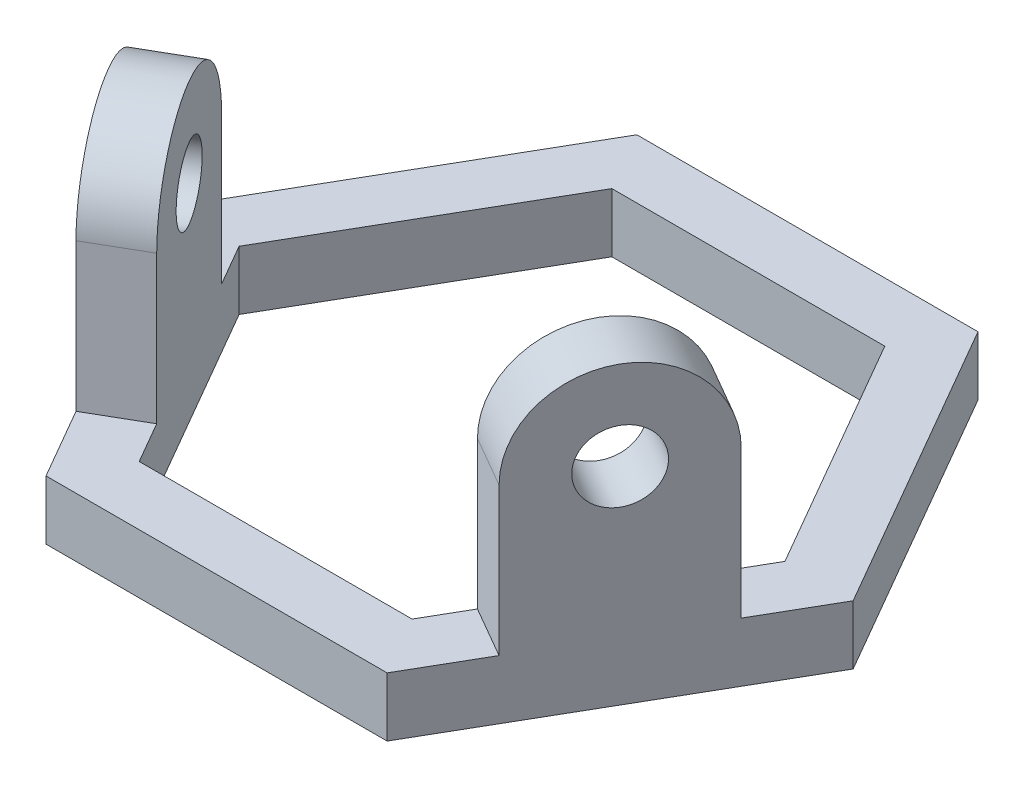
ISO-10303-21;
HEADER;
FILE_DESCRIPTION(('STEP AP214'),'2;1');
FILE_NAME('part.step','',(''),(''),'','','');
FILE_SCHEMA(('AUTOMOTIVE_DESIGN { 1 0 10303 214 1 1 1 1 }'));
ENDSEC;
DATA;
#1=APPLICATION_CONTEXT('core data for automotive mechanical design processes');
#2=APPLICATION_PROTOCOL_DEFINITION('international standard','automotive_design',2000,#1);
#3=PRODUCT_CONTEXT('',#1,'mechanical');
#4=PRODUCT('Part','Part','',(#3));
#5=PRODUCT_RELATED_PRODUCT_CATEGORY('part','',(#4));
#6=PRODUCT_DEFINITION_FORMATION('','',#4);
#7=PRODUCT_DEFINITION_CONTEXT('part definition',#1,'design');
#8=PRODUCT_DEFINITION('design','',#6,#7);
#9=PRODUCT_DEFINITION_SHAPE('','',#8);
#10=(LENGTH_UNIT() NAMED_UNIT(*) SI_UNIT(.MILLI.,.METRE.));
#11=(NAMED_UNIT(*) PLANE_ANGLE_UNIT() SI_UNIT($,.RADIAN.));
#12=(NAMED_UNIT(*) SI_UNIT($,.STERADIAN.) SOLID_ANGLE_UNIT());
#13=UNCERTAINTY_MEASURE_WITH_UNIT(LENGTH_MEASURE(1.E-05),#10,'distance_accuracy_value','');
#14=(GEOMETRIC_REPRESENTATION_CONTEXT(3) GLOBAL_UNCERTAINTY_ASSIGNED_CONTEXT((#13)) GLOBAL_UNIT_ASSIGNED_CONTEXT((#10,
#11,#12)) REPRESENTATION_CONTEXT('',''));
#15=CARTESIAN_POINT('',(0.,0.,0.));
#16=DIRECTION('',(0.,0.,1.));
#17=DIRECTION('',(1.,0.,0.));
#18=AXIS2_PLACEMENT_3D('',#15,#16,#17);
#19=CARTESIAN_POINT('',(0.,10.,0.));
#20=DIRECTION('',(0.,1.,0.));
#21=DIRECTION('',(0.,0.,1.));
#22=AXIS2_PLACEMENT_3D('',#19,#20,#21);
#23=PLANE('',#22);
#24=DIRECTION('',(0.866025403784434,0.,-0.500000000000009));
#25=VECTOR('',#24,1.);
#26=CARTESIAN_POINT('',(7.50000000000012,10.,12.9903810567665));
#27=LINE('',#26,#25);
#28=CARTESIAN_POINT('',(-35.8012701892216,10.,37.990381056767));
#29=VERTEX_POINT('',#28);
#30=CARTESIAN_POINT('',(-27.1410161513772,10.,32.9903810567668));
#31=VERTEX_POINT('',#30);
#32=EDGE_CURVE('E232',#29,#31,#27,.T.);
#33=ORIENTED_EDGE('',*,*,#32,.F.);
#34=DIRECTION('',(0.500000000000008,0.,0.866025403784434));
#35=VECTOR('',#34,1.);
#36=CARTESIAN_POINT('',(-57.7350269189626,10.,6.46272804624254E-13));
#37=LINE('',#36,#35);
#38=CARTESIAN_POINT('',(-28.8675134594808,10.,50.0000000000003));
#39=VERTEX_POINT('',#38);
#40=EDGE_CURVE('E189',#29,#39,#37,.T.);
#41=ORIENTED_EDGE('',*,*,#40,.T.);
#42=DIRECTION('',(1.,0.,0.));
#43=VECTOR('',#42,1.);
#44=CARTESIAN_POINT('',(-28.8675134594808,10.,50.0000000000003));
#45=LINE('',#44,#43);
#46=CARTESIAN_POINT('',(28.8675134594819,10.,49.9999999999997));
#47=VERTEX_POINT('',#46);
#48=EDGE_CURVE('E361',#39,#47,#45,.T.);
#49=ORIENTED_EDGE('',*,*,#48,.T.);
#50=DIRECTION('',(0.49999999999999,0.,-0.866025403784444));
#51=VECTOR('',#50,1.);
#52=CARTESIAN_POINT('',(28.8675134594819,10.,49.9999999999997));
#53=LINE('',#52,#51);
#54=CARTESIAN_POINT('',(35.8012701892224,10.,37.9903810567662));
#55=VERTEX_POINT('',#54);
#56=EDGE_CURVE('E343',#47,#55,#53,.T.);
#57=ORIENTED_EDGE('',*,*,#56,.T.);
#58=DIRECTION('',(0.866025403784444,0.,0.49999999999999));
#59=VECTOR('',#58,1.);
#60=CARTESIAN_POINT('',(-7.49999999999985,10.,12.9903810567667));
#61=LINE('',#60,#59);
#62=CARTESIAN_POINT('',(27.1410161513779,10.,32.9903810567663));
#63=VERTEX_POINT('',#62);
#64=EDGE_CURVE('E256',#63,#55,#61,.T.);
#65=ORIENTED_EDGE('',*,*,#64,.F.);
#66=DIRECTION('',(0.49999999999999,0.,-0.866025403784444));
#67=VECTOR('',#66,1.);
#68=CARTESIAN_POINT('',(23.0940107675855,10.,39.9999999999997));
#69=LINE('',#68,#67);
#70=CARTESIAN_POINT('',(23.0940107675855,10.,39.9999999999997));
#71=VERTEX_POINT('',#70);
#72=EDGE_CURVE('E297',#71,#63,#69,.T.);
#73=ORIENTED_EDGE('',*,*,#72,.F.);
#74=DIRECTION('',(1.,0.,0.));
#75=VECTOR('',#74,1.);
#76=CARTESIAN_POINT('',(-23.0940107675846,10.,40.0000000000003));
#77=LINE('',#76,#75);
#78=CARTESIAN_POINT('',(-23.0940107675846,10.,40.0000000000003));
#79=VERTEX_POINT('',#78);
#80=EDGE_CURVE('E292',#79,#71,#77,.T.);
#81=ORIENTED_EDGE('',*,*,#80,.F.);
#82=DIRECTION('',(0.50000000000001,0.,0.866025403784433));
#83=VECTOR('',#82,1.);
#84=CARTESIAN_POINT('',(-46.1880215351701,10.,5.03069808033274E-13));
#85=LINE('',#84,#83);
#86=EDGE_CURVE('E287',#31,#79,#85,.T.);
#87=ORIENTED_EDGE('',*,*,#86,.F.);
#88=EDGE_LOOP('',(#33,#41,#49,#57,#65,#73,#81,#87));
#89=FACE_BOUND('',#88,.T.);
#90=ADVANCED_FACE('F43',(#89),#23,.T.);
#91=DIRECTION('',(-0.866025403784434,0.,0.500000000000009));
#92=VECTOR('',#91,1.);
#93=CARTESIAN_POINT('',(-7.50000000000013,10.,-12.9903810567665));
#94=LINE('',#93,#92);
#95=CARTESIAN_POINT('',(-42.1410161513775,10.,7.00961894323384));
#96=VERTEX_POINT('',#95);
#97=CARTESIAN_POINT('',(-50.8012701892219,10.,12.009618943234));
#98=VERTEX_POINT('',#97);
#99=EDGE_CURVE('E220',#96,#98,#94,.T.);
#100=ORIENTED_EDGE('',*,*,#99,.F.);
#101=CARTESIAN_POINT('',(-46.1880215351701,10.,5.03069808033274E-13));
#102=VERTEX_POINT('',#101);
#103=EDGE_CURVE('E288',#102,#96,#85,.T.);
#104=ORIENTED_EDGE('',*,*,#103,.F.);
#105=DIRECTION('',(-0.49999999999999,0.,0.866025403784444));
#106=VECTOR('',#105,1.);
#107=CARTESIAN_POINT('',(-23.0940107675855,10.,-39.9999999999997));
#108=LINE('',#107,#106);
#109=CARTESIAN_POINT('',(-23.0940107675855,10.,-39.9999999999997));
#110=VERTEX_POINT('',#109);
#111=EDGE_CURVE('E284',#110,#102,#108,.T.);
#112=ORIENTED_EDGE('',*,*,#111,.F.);
#113=DIRECTION('',(-1.,0.,0.));
#114=VECTOR('',#113,1.);
#115=CARTESIAN_POINT('',(23.0940107675846,10.,-40.0000000000003));
#116=LINE('',#115,#114);
#117=CARTESIAN_POINT('',(23.0940107675846,10.,-40.0000000000003));
#118=VERTEX_POINT('',#117);
#119=EDGE_CURVE('E280',#118,#110,#116,.T.);
#120=ORIENTED_EDGE('',*,*,#119,.F.);
#121=DIRECTION('',(-0.50000000000001,0.,-0.866025403784433));
#122=VECTOR('',#121,1.);
#123=CARTESIAN_POINT('',(46.1880215351701,10.,-5.03069808033274E-13));
#124=LINE('',#123,#122);
#125=CARTESIAN_POINT('',(46.1880215351701,10.,-5.03069808033274E-13));
#126=VERTEX_POINT('',#125);
#127=EDGE_CURVE('E277',#126,#118,#124,.T.);
#128=ORIENTED_EDGE('',*,*,#127,.F.);
#129=CARTESIAN_POINT('',(42.1410161513776,10.,7.00961894323296));
#130=VERTEX_POINT('',#129);
#131=EDGE_CURVE('E296',#130,#126,#69,.T.);
#132=ORIENTED_EDGE('',*,*,#131,.F.);
#133=DIRECTION('',(-0.866025403784444,0.,-0.49999999999999));
#134=VECTOR('',#133,1.);
#135=CARTESIAN_POINT('',(7.49999999999986,10.,-12.9903810567667));
#136=LINE('',#135,#134);
#137=CARTESIAN_POINT('',(50.8012701892221,10.,12.0096189432329));
#138=VERTEX_POINT('',#137);
#139=EDGE_CURVE('E273',#138,#130,#136,.T.);
#140=ORIENTED_EDGE('',*,*,#139,.F.);
#141=CARTESIAN_POINT('',(57.7350269189626,10.,-6.45317133063372E-13));
#142=VERTEX_POINT('',#141);
#143=EDGE_CURVE('E348',#138,#142,#53,.T.);
#144=ORIENTED_EDGE('',*,*,#143,.T.);
#145=DIRECTION('',(-0.50000000000001,0.,-0.866025403784433));
#146=VECTOR('',#145,1.);
#147=CARTESIAN_POINT('',(57.7350269189626,10.,-6.45317133063372E-13));
#148=LINE('',#147,#146);
#149=CARTESIAN_POINT('',(28.8675134594807,10.,-50.0000000000003));
#150=VERTEX_POINT('',#149);
#151=EDGE_CURVE('E347',#142,#150,#148,.T.);
#152=ORIENTED_EDGE('',*,*,#151,.T.);
#153=DIRECTION('',(-1.,0.,0.));
#154=VECTOR('',#153,1.);
#155=CARTESIAN_POINT('',(28.8675134594807,10.,-50.0000000000003));
#156=LINE('',#155,#154);
#157=CARTESIAN_POINT('',(-28.8675134594819,10.,-49.9999999999997));
#158=VERTEX_POINT('',#157);
#159=EDGE_CURVE('E351',#150,#158,#156,.T.);
#160=ORIENTED_EDGE('',*,*,#159,.T.);
#161=DIRECTION('',(-0.49999999999999,0.,0.866025403784444));
#162=VECTOR('',#161,1.);
#163=CARTESIAN_POINT('',(-28.8675134594819,10.,-49.9999999999997));
#164=LINE('',#163,#162);
#165=CARTESIAN_POINT('',(-57.7350269189626,10.,6.46272804624254E-13));
#166=VERTEX_POINT('',#165);
#167=EDGE_CURVE('E354',#158,#166,#164,.T.);
#168=ORIENTED_EDGE('',*,*,#167,.T.);
#169=EDGE_CURVE('E357',#166,#98,#37,.T.);
#170=ORIENTED_EDGE('',*,*,#169,.T.);
#171=EDGE_LOOP('',(#100,#104,#112,#120,#128,#132,#140,#144,#152,#160,#168,#170));
#172=FACE_BOUND('',#171,.T.);
#173=ADVANCED_FACE('F420',(#172),#23,.T.);
#174=CARTESIAN_POINT('',(0.,0.,0.));
#175=DIRECTION('',(0.,1.,0.));
#176=DIRECTION('',(0.,0.,1.));
#177=AXIS2_PLACEMENT_3D('',#174,#175,#176);
#178=PLANE('',#177);
#179=DIRECTION('',(0.50000000000001,0.,0.866025403784433));
#180=VECTOR('',#179,1.);
#181=CARTESIAN_POINT('',(-46.1880215351701,0.,5.03069808033274E-13));
#182=LINE('',#181,#180);
#183=CARTESIAN_POINT('',(-46.1880215351701,0.,5.03069808033274E-13));
#184=VERTEX_POINT('',#183);
#185=CARTESIAN_POINT('',(-23.0940107675846,0.,40.0000000000003));
#186=VERTEX_POINT('',#185);
#187=EDGE_CURVE('E313',#184,#186,#182,.T.);
#188=ORIENTED_EDGE('',*,*,#187,.T.);
#189=DIRECTION('',(1.,0.,0.));
#190=VECTOR('',#189,1.);
#191=CARTESIAN_POINT('',(-23.0940107675846,0.,40.0000000000003));
#192=LINE('',#191,#190);
#193=CARTESIAN_POINT('',(23.0940107675855,0.,39.9999999999997));
#194=VERTEX_POINT('',#193);
#195=EDGE_CURVE('E316',#186,#194,#192,.T.);
#196=ORIENTED_EDGE('',*,*,#195,.T.);
#197=DIRECTION('',(0.49999999999999,0.,-0.866025403784444));
#198=VECTOR('',#197,1.);
#199=CARTESIAN_POINT('',(23.0940107675855,0.,39.9999999999997));
#200=LINE('',#199,#198);
#201=CARTESIAN_POINT('',(46.1880215351701,0.,-5.03069808033274E-13));
#202=VERTEX_POINT('',#201);
#203=EDGE_CURVE('E281',#194,#202,#200,.T.);
#204=ORIENTED_EDGE('',*,*,#203,.T.);
#205=DIRECTION('',(-0.50000000000001,0.,-0.866025403784433));
#206=VECTOR('',#205,1.);
#207=CARTESIAN_POINT('',(46.1880215351701,0.,-5.03069808033274E-13));
#208=LINE('',#207,#206);
#209=CARTESIAN_POINT('',(23.0940107675846,0.,-40.0000000000003));
#210=VERTEX_POINT('',#209);
#211=EDGE_CURVE('E276',#202,#210,#208,.T.);
#212=ORIENTED_EDGE('',*,*,#211,.T.);
#213=DIRECTION('',(-1.,0.,0.));
#214=VECTOR('',#213,1.);
#215=CARTESIAN_POINT('',(23.0940107675846,0.,-40.0000000000003));
#216=LINE('',#215,#214);
#217=CARTESIAN_POINT('',(-23.0940107675855,0.,-39.9999999999997));
#218=VERTEX_POINT('',#217);
#219=EDGE_CURVE('E305',#210,#218,#216,.T.);
#220=ORIENTED_EDGE('',*,*,#219,.T.);
#221=DIRECTION('',(-0.49999999999999,0.,0.866025403784444));
#222=VECTOR('',#221,1.);
#223=CARTESIAN_POINT('',(-23.0940107675855,0.,-39.9999999999997));
#224=LINE('',#223,#222);
#225=EDGE_CURVE('E309',#218,#184,#224,.T.);
#226=ORIENTED_EDGE('',*,*,#225,.T.);
#227=EDGE_LOOP('',(#188,#196,#204,#212,#220,#226));
#228=FACE_BOUND('',#227,.T.);
#229=DIRECTION('',(1.,0.,0.));
#230=VECTOR('',#229,1.);
#231=CARTESIAN_POINT('',(-28.8675134594808,0.,50.0000000000003));
#232=LINE('',#231,#230);
#233=CARTESIAN_POINT('',(-28.8675134594808,0.,50.0000000000003));
#234=VERTEX_POINT('',#233);
#235=CARTESIAN_POINT('',(28.8675134594819,0.,49.9999999999997));
#236=VERTEX_POINT('',#235);
#237=EDGE_CURVE('E379',#234,#236,#232,.T.);
#238=ORIENTED_EDGE('',*,*,#237,.F.);
#239=DIRECTION('',(0.500000000000008,0.,0.866025403784434));
#240=VECTOR('',#239,1.);
#241=CARTESIAN_POINT('',(-57.7350269189626,0.,6.46272804624254E-13));
#242=LINE('',#241,#240);
#243=CARTESIAN_POINT('',(-57.7350269189626,0.,6.46272804624254E-13));
#244=VERTEX_POINT('',#243);
#245=EDGE_CURVE('E376',#244,#234,#242,.T.);
#246=ORIENTED_EDGE('',*,*,#245,.F.);
#247=DIRECTION('',(-0.49999999999999,0.,0.866025403784444));
#248=VECTOR('',#247,1.);
#249=CARTESIAN_POINT('',(-28.8675134594819,0.,-49.9999999999997));
#250=LINE('',#249,#248);
#251=CARTESIAN_POINT('',(-28.8675134594819,0.,-49.9999999999997));
#252=VERTEX_POINT('',#251);
#253=EDGE_CURVE('E373',#252,#244,#250,.T.);
#254=ORIENTED_EDGE('',*,*,#253,.F.);
#255=DIRECTION('',(-1.,0.,0.));
#256=VECTOR('',#255,1.);
#257=CARTESIAN_POINT('',(28.8675134594807,0.,-50.0000000000003));
#258=LINE('',#257,#256);
#259=CARTESIAN_POINT('',(28.8675134594807,0.,-50.0000000000003));
#260=VERTEX_POINT('',#259);
#261=EDGE_CURVE('E370',#260,#252,#258,.T.);
#262=ORIENTED_EDGE('',*,*,#261,.F.);
#263=DIRECTION('',(-0.50000000000001,0.,-0.866025403784433));
#264=VECTOR('',#263,1.);
#265=CARTESIAN_POINT('',(57.7350269189626,0.,-6.45317133063372E-13));
#266=LINE('',#265,#264);
#267=CARTESIAN_POINT('',(57.7350269189626,0.,-6.45317133063372E-13));
#268=VERTEX_POINT('',#267);
#269=EDGE_CURVE('E367',#268,#260,#266,.T.);
#270=ORIENTED_EDGE('',*,*,#269,.F.);
#271=DIRECTION('',(0.49999999999999,0.,-0.866025403784444));
#272=VECTOR('',#271,1.);
#273=CARTESIAN_POINT('',(28.8675134594819,0.,49.9999999999997));
#274=LINE('',#273,#272);
#275=EDGE_CURVE('E342',#236,#268,#274,.T.);
#276=ORIENTED_EDGE('',*,*,#275,.F.);
#277=EDGE_LOOP('',(#238,#246,#254,#262,#270,#276));
#278=FACE_BOUND('',#277,.T.);
#279=ADVANCED_FACE('F410',(#228,#278),#178,.F.);
#280=CARTESIAN_POINT('',(28.8675134594819,10.,49.9999999999997));
#281=DIRECTION('',(-0.866025403784444,0.,-0.49999999999999));
#282=DIRECTION('',(-0.49999999999999,0.,0.866025403784444));
#283=AXIS2_PLACEMENT_3D('',#280,#281,#282);
#284=PLANE('',#283);
#285=ORIENTED_EDGE('',*,*,#275,.T.);
#286=DIRECTION('',(0.,-1.,0.));
#287=VECTOR('',#286,1.);
#288=CARTESIAN_POINT('',(57.7350269189626,10.,-6.45317133063372E-13));
#289=LINE('',#288,#287);
#290=EDGE_CURVE('E11',#142,#268,#289,.T.);
#291=ORIENTED_EDGE('',*,*,#290,.F.);
#292=ORIENTED_EDGE('',*,*,#143,.F.);
#293=DIRECTION('',(0.,1.,0.));
#294=VECTOR('',#293,1.);
#295=CARTESIAN_POINT('',(50.8012701892221,0.,12.0096189432329));
#296=LINE('',#295,#294);
#297=CARTESIAN_POINT('',(50.8012701892221,35.,12.0096189432329));
#298=VERTEX_POINT('',#297);
#299=EDGE_CURVE('E236',#138,#298,#296,.T.);
#300=ORIENTED_EDGE('',*,*,#299,.T.);
#301=CARTESIAN_POINT('',(43.3012701892223,35.,24.9999999999995));
#302=DIRECTION('',(0.866025403784444,0.,0.49999999999999));
#303=DIRECTION('',(-0.49999999999999,0.,0.866025403784444));
#304=AXIS2_PLACEMENT_3D('',#301,#302,#303);
#305=CIRCLE('',#304,15.);
#306=CARTESIAN_POINT('',(35.8012701892224,35.,37.9903810567662));
#307=VERTEX_POINT('',#306);
#308=EDGE_CURVE('E244',#298,#307,#305,.T.);
#309=ORIENTED_EDGE('',*,*,#308,.T.);
#310=DIRECTION('',(0.,-1.,0.));
#311=VECTOR('',#310,1.);
#312=CARTESIAN_POINT('',(35.8012701892224,35.,37.9903810567662));
#313=LINE('',#312,#311);
#314=EDGE_CURVE('E240',#307,#55,#313,.T.);
#315=ORIENTED_EDGE('',*,*,#314,.T.);
#316=ORIENTED_EDGE('',*,*,#56,.F.);
#317=DIRECTION('',(0.,-1.,0.));
#318=VECTOR('',#317,1.);
#319=CARTESIAN_POINT('',(28.8675134594819,10.,49.9999999999997));
#320=LINE('',#319,#318);
#321=EDGE_CURVE('E364',#47,#236,#320,.T.);
#322=ORIENTED_EDGE('',*,*,#321,.T.);
#323=EDGE_LOOP('',(#285,#291,#292,#300,#309,#315,#316,#322));
#324=FACE_BOUND('',#323,.T.);
#325=CARTESIAN_POINT('',(43.3012701892223,35.,24.9999999999995));
#326=DIRECTION('',(0.866025403784444,0.,0.49999999999999));
#327=DIRECTION('',(0.49999999999999,0.,-0.866025403784444));
#328=AXIS2_PLACEMENT_3D('',#325,#326,#327);
#329=CIRCLE('',#328,6.);
#330=CARTESIAN_POINT('',(46.3012701892222,35.,19.8038475772929));
#331=VERTEX_POINT('',#330);
#332=EDGE_CURVE('E248',#331,#331,#329,.T.);
#333=ORIENTED_EDGE('',*,*,#332,.F.);
#334=EDGE_LOOP('',(#333));
#335=FACE_BOUND('',#334,.T.);
#336=ADVANCED_FACE('F45',(#324,#335),#284,.F.);
#337=CARTESIAN_POINT('',(57.7350269189626,10.,-6.45317133063372E-13));
#338=DIRECTION('',(-0.866025403784433,0.,0.50000000000001));
#339=DIRECTION('',(0.50000000000001,0.,0.866025403784433));
#340=AXIS2_PLACEMENT_3D('',#337,#338,#339);
#341=PLANE('',#340);
#342=ORIENTED_EDGE('',*,*,#269,.T.);
#343=DIRECTION('',(0.,-1.,0.));
#344=VECTOR('',#343,1.);
#345=CARTESIAN_POINT('',(28.8675134594807,10.,-50.0000000000003));
#346=LINE('',#345,#344);
#347=EDGE_CURVE('E52',#150,#260,#346,.T.);
#348=ORIENTED_EDGE('',*,*,#347,.F.);
#349=ORIENTED_EDGE('',*,*,#151,.F.);
#350=ORIENTED_EDGE('',*,*,#290,.T.);
#351=EDGE_LOOP('',(#342,#348,#349,#350));
#352=FACE_BOUND('',#351,.T.);
#353=ADVANCED_FACE('F425',(#352),#341,.F.);
#354=CARTESIAN_POINT('',(28.8675134594807,10.,-50.0000000000003));
#355=DIRECTION('',(0.,0.,1.));
#356=DIRECTION('',(1.,0.,0.));
#357=AXIS2_PLACEMENT_3D('',#354,#355,#356);
#358=PLANE('',#357);
#359=ORIENTED_EDGE('',*,*,#261,.T.);
#360=DIRECTION('',(0.,-1.,0.));
#361=VECTOR('',#360,1.);
#362=CARTESIAN_POINT('',(-28.8675134594819,10.,-49.9999999999997));
#363=LINE('',#362,#361);
#364=EDGE_CURVE('E393',#158,#252,#363,.T.);
#365=ORIENTED_EDGE('',*,*,#364,.F.);
#366=ORIENTED_EDGE('',*,*,#159,.F.);
#367=ORIENTED_EDGE('',*,*,#347,.T.);
#368=EDGE_LOOP('',(#359,#365,#366,#367));
#369=FACE_BOUND('',#368,.T.);
#370=ADVANCED_FACE('F402',(#369),#358,.F.);
#371=CARTESIAN_POINT('',(-28.8675134594819,10.,-49.9999999999997));
#372=DIRECTION('',(0.866025403784444,0.,0.49999999999999));
#373=DIRECTION('',(0.49999999999999,0.,-0.866025403784444));
#374=AXIS2_PLACEMENT_3D('',#371,#372,#373);
#375=PLANE('',#374);
#376=ORIENTED_EDGE('',*,*,#253,.T.);
#377=DIRECTION('',(0.,-1.,0.));
#378=VECTOR('',#377,1.);
#379=CARTESIAN_POINT('',(-57.7350269189626,10.,6.46272804624254E-13));
#380=LINE('',#379,#378);
#381=EDGE_CURVE('E389',#166,#244,#380,.T.);
#382=ORIENTED_EDGE('',*,*,#381,.F.);
#383=ORIENTED_EDGE('',*,*,#167,.F.);
#384=ORIENTED_EDGE('',*,*,#364,.T.);
#385=EDGE_LOOP('',(#376,#382,#383,#384));
#386=FACE_BOUND('',#385,.T.);
#387=ADVANCED_FACE('F415',(#386),#375,.F.);
#388=CARTESIAN_POINT('',(-57.7350269189626,10.,6.46272804624254E-13));
#389=DIRECTION('',(0.866025403784434,0.,-0.500000000000008));
#390=DIRECTION('',(-0.500000000000008,0.,-0.866025403784434));
#391=AXIS2_PLACEMENT_3D('',#388,#389,#390);
#392=PLANE('',#391);
#393=ORIENTED_EDGE('',*,*,#245,.T.);
#394=DIRECTION('',(0.,-1.,0.));
#395=VECTOR('',#394,1.);
#396=CARTESIAN_POINT('',(-28.8675134594808,10.,50.0000000000003));
#397=LINE('',#396,#395);
#398=EDGE_CURVE('E385',#39,#234,#397,.T.);
#399=ORIENTED_EDGE('',*,*,#398,.F.);
#400=ORIENTED_EDGE('',*,*,#40,.F.);
#401=DIRECTION('',(0.,1.,0.));
#402=VECTOR('',#401,1.);
#403=CARTESIAN_POINT('',(-35.8012701892216,0.,37.990381056767));
#404=LINE('',#403,#402);
#405=CARTESIAN_POINT('',(-35.8012701892216,35.,37.990381056767));
#406=VERTEX_POINT('',#405);
#407=EDGE_CURVE('E181',#29,#406,#404,.T.);
#408=ORIENTED_EDGE('',*,*,#407,.T.);
#409=CARTESIAN_POINT('',(-43.3012701892218,35.,25.0000000000005));
#410=DIRECTION('',(-0.866025403784434,0.,0.500000000000008));
#411=DIRECTION('',(-0.500000000000009,0.,-0.866025403784434));
#412=AXIS2_PLACEMENT_3D('',#409,#410,#411);
#413=CIRCLE('',#412,15.);
#414=CARTESIAN_POINT('',(-50.8012701892219,35.,12.009618943234));
#415=VERTEX_POINT('',#414);
#416=EDGE_CURVE('E187',#406,#415,#413,.T.);
#417=ORIENTED_EDGE('',*,*,#416,.T.);
#418=DIRECTION('',(0.,-1.,0.));
#419=VECTOR('',#418,1.);
#420=CARTESIAN_POINT('',(-50.8012701892219,35.,12.009618943234));
#421=LINE('',#420,#419);
#422=EDGE_CURVE('E194',#415,#98,#421,.T.);
#423=ORIENTED_EDGE('',*,*,#422,.T.);
#424=ORIENTED_EDGE('',*,*,#169,.F.);
#425=ORIENTED_EDGE('',*,*,#381,.T.);
#426=EDGE_LOOP('',(#393,#399,#400,#408,#417,#423,#424,#425));
#427=FACE_BOUND('',#426,.T.);
#428=CARTESIAN_POINT('',(-43.3012701892218,35.,25.0000000000005));
#429=DIRECTION('',(-0.866025403784434,0.,0.500000000000008));
#430=DIRECTION('',(0.500000000000009,0.,0.866025403784434));
#431=AXIS2_PLACEMENT_3D('',#428,#429,#430);
#432=CIRCLE('',#431,6.);
#433=CARTESIAN_POINT('',(-40.3012701892217,35.,30.1961524227071));
#434=VERTEX_POINT('',#433);
#435=EDGE_CURVE('E209',#434,#434,#432,.T.);
#436=ORIENTED_EDGE('',*,*,#435,.F.);
#437=EDGE_LOOP('',(#436));
#438=FACE_BOUND('',#437,.T.);
#439=ADVANCED_FACE('F183',(#427,#438),#392,.F.);
#440=CARTESIAN_POINT('',(-28.8675134594808,10.,50.0000000000003));
#441=DIRECTION('',(0.,0.,-1.));
#442=DIRECTION('',(-1.,0.,0.));
#443=AXIS2_PLACEMENT_3D('',#440,#441,#442);
#444=PLANE('',#443);
#445=ORIENTED_EDGE('',*,*,#237,.T.);
#446=ORIENTED_EDGE('',*,*,#321,.F.);
#447=ORIENTED_EDGE('',*,*,#48,.F.);
#448=ORIENTED_EDGE('',*,*,#398,.T.);
#449=EDGE_LOOP('',(#445,#446,#447,#448));
#450=FACE_BOUND('',#449,.T.);
#451=ADVANCED_FACE('F431',(#450),#444,.F.);
#452=CARTESIAN_POINT('',(46.1880215351701,10.,-5.03069808033274E-13));
#453=DIRECTION('',(-0.866025403784433,0.,0.50000000000001));
#454=DIRECTION('',(0.50000000000001,0.,0.866025403784433));
#455=AXIS2_PLACEMENT_3D('',#452,#453,#454);
#456=PLANE('',#455);
#457=ORIENTED_EDGE('',*,*,#211,.F.);
#458=DIRECTION('',(0.,-1.,0.));
#459=VECTOR('',#458,1.);
#460=CARTESIAN_POINT('',(46.1880215351701,10.,-5.03069808033274E-13));
#461=LINE('',#460,#459);
#462=EDGE_CURVE('E301',#126,#202,#461,.T.);
#463=ORIENTED_EDGE('',*,*,#462,.F.);
#464=ORIENTED_EDGE('',*,*,#127,.T.);
#465=DIRECTION('',(0.,-1.,0.));
#466=VECTOR('',#465,1.);
#467=CARTESIAN_POINT('',(23.0940107675846,10.,-40.0000000000003));
#468=LINE('',#467,#466);
#469=EDGE_CURVE('E338',#118,#210,#468,.T.);
#470=ORIENTED_EDGE('',*,*,#469,.T.);
#471=EDGE_LOOP('',(#457,#463,#464,#470));
#472=FACE_BOUND('',#471,.T.);
#473=ADVANCED_FACE('F467',(#472),#456,.T.);
#474=CARTESIAN_POINT('',(23.0940107675846,10.,-40.0000000000003));
#475=DIRECTION('',(0.,0.,1.));
#476=DIRECTION('',(1.,0.,0.));
#477=AXIS2_PLACEMENT_3D('',#474,#475,#476);
#478=PLANE('',#477);
#479=ORIENTED_EDGE('',*,*,#219,.F.);
#480=ORIENTED_EDGE('',*,*,#469,.F.);
#481=ORIENTED_EDGE('',*,*,#119,.T.);
#482=DIRECTION('',(0.,-1.,0.));
#483=VECTOR('',#482,1.);
#484=CARTESIAN_POINT('',(-23.0940107675855,10.,-39.9999999999997));
#485=LINE('',#484,#483);
#486=EDGE_CURVE('E335',#110,#218,#485,.T.);
#487=ORIENTED_EDGE('',*,*,#486,.T.);
#488=EDGE_LOOP('',(#479,#480,#481,#487));
#489=FACE_BOUND('',#488,.T.);
#490=ADVANCED_FACE('F464',(#489),#478,.T.);
#491=CARTESIAN_POINT('',(-23.0940107675855,10.,-39.9999999999997));
#492=DIRECTION('',(0.866025403784444,0.,0.49999999999999));
#493=DIRECTION('',(0.49999999999999,0.,-0.866025403784444));
#494=AXIS2_PLACEMENT_3D('',#491,#492,#493);
#495=PLANE('',#494);
#496=ORIENTED_EDGE('',*,*,#225,.F.);
#497=ORIENTED_EDGE('',*,*,#486,.F.);
#498=ORIENTED_EDGE('',*,*,#111,.T.);
#499=DIRECTION('',(0.,-1.,0.));
#500=VECTOR('',#499,1.);
#501=CARTESIAN_POINT('',(-46.1880215351701,10.,5.03069808033274E-13));
#502=LINE('',#501,#500);
#503=EDGE_CURVE('E332',#102,#184,#502,.T.);
#504=ORIENTED_EDGE('',*,*,#503,.T.);
#505=EDGE_LOOP('',(#496,#497,#498,#504));
#506=FACE_BOUND('',#505,.T.);
#507=ADVANCED_FACE('F462',(#506),#495,.T.);
#508=CARTESIAN_POINT('',(-46.1880215351701,10.,5.03069808033274E-13));
#509=DIRECTION('',(0.866025403784433,0.,-0.50000000000001));
#510=DIRECTION('',(-0.50000000000001,0.,-0.866025403784433));
#511=AXIS2_PLACEMENT_3D('',#508,#509,#510);
#512=PLANE('',#511);
#513=ORIENTED_EDGE('',*,*,#103,.T.);
#514=DIRECTION('',(0.,-1.,0.));
#515=VECTOR('',#514,1.);
#516=CARTESIAN_POINT('',(-42.1410161513775,35.,7.00961894323384));
#517=LINE('',#516,#515);
#518=CARTESIAN_POINT('',(-42.1410161513775,35.,7.00961894323384));
#519=VERTEX_POINT('',#518);
#520=EDGE_CURVE('E202',#519,#96,#517,.T.);
#521=ORIENTED_EDGE('',*,*,#520,.F.);
#522=CARTESIAN_POINT('',(-34.6410161513773,35.,20.0000000000003));
#523=DIRECTION('',(0.866025403784433,0.,-0.50000000000001));
#524=DIRECTION('',(-0.50000000000001,0.,-0.866025403784433));
#525=AXIS2_PLACEMENT_3D('',#522,#523,#524);
#526=CIRCLE('',#525,15.);
#527=CARTESIAN_POINT('',(-27.1410161513772,35.,32.9903810567668));
#528=VERTEX_POINT('',#527);
#529=EDGE_CURVE('E223',#528,#519,#526,.F.);
#530=ORIENTED_EDGE('',*,*,#529,.F.);
#531=DIRECTION('',(0.,1.,0.));
#532=VECTOR('',#531,1.);
#533=CARTESIAN_POINT('',(-27.1410161513772,0.,32.9903810567668));
#534=LINE('',#533,#532);
#535=EDGE_CURVE('E59',#31,#528,#534,.T.);
#536=ORIENTED_EDGE('',*,*,#535,.F.);
#537=ORIENTED_EDGE('',*,*,#86,.T.);
#538=DIRECTION('',(0.,-1.,0.));
#539=VECTOR('',#538,1.);
#540=CARTESIAN_POINT('',(-23.0940107675846,10.,40.0000000000003));
#541=LINE('',#540,#539);
#542=EDGE_CURVE('E328',#79,#186,#541,.T.);
#543=ORIENTED_EDGE('',*,*,#542,.T.);
#544=ORIENTED_EDGE('',*,*,#187,.F.);
#545=ORIENTED_EDGE('',*,*,#503,.F.);
#546=EDGE_LOOP('',(#513,#521,#530,#536,#537,#543,#544,#545));
#547=FACE_BOUND('',#546,.T.);
#548=CARTESIAN_POINT('',(-34.6410161513773,35.,20.0000000000003));
#549=DIRECTION('',(0.866025403784433,0.,-0.50000000000001));
#550=DIRECTION('',(-0.50000000000001,0.,-0.866025403784433));
#551=AXIS2_PLACEMENT_3D('',#548,#549,#550);
#552=CIRCLE('',#551,6.);
#553=CARTESIAN_POINT('',(-37.6410161513774,35.,14.8038475772937));
#554=VERTEX_POINT('',#553);
#555=EDGE_CURVE('E193',#554,#554,#552,.F.);
#556=ORIENTED_EDGE('',*,*,#555,.T.);
#557=EDGE_LOOP('',(#556));
#558=FACE_BOUND('',#557,.T.);
#559=ADVANCED_FACE('F441',(#547,#558),#512,.T.);
#560=CARTESIAN_POINT('',(-23.0940107675846,10.,40.0000000000003));
#561=DIRECTION('',(0.,0.,-1.));
#562=DIRECTION('',(-1.,0.,0.));
#563=AXIS2_PLACEMENT_3D('',#560,#561,#562);
#564=PLANE('',#563);
#565=ORIENTED_EDGE('',*,*,#195,.F.);
#566=ORIENTED_EDGE('',*,*,#542,.F.);
#567=ORIENTED_EDGE('',*,*,#80,.T.);
#568=DIRECTION('',(0.,-1.,0.));
#569=VECTOR('',#568,1.);
#570=CARTESIAN_POINT('',(23.0940107675855,10.,39.9999999999997));
#571=LINE('',#570,#569);
#572=EDGE_CURVE('E325',#71,#194,#571,.T.);
#573=ORIENTED_EDGE('',*,*,#572,.T.);
#574=EDGE_LOOP('',(#565,#566,#567,#573));
#575=FACE_BOUND('',#574,.T.);
#576=ADVANCED_FACE('F447',(#575),#564,.T.);
#577=CARTESIAN_POINT('',(23.0940107675855,10.,39.9999999999997));
#578=DIRECTION('',(-0.866025403784444,0.,-0.49999999999999));
#579=DIRECTION('',(-0.49999999999999,0.,0.866025403784444));
#580=AXIS2_PLACEMENT_3D('',#577,#578,#579);
#581=PLANE('',#580);
#582=ORIENTED_EDGE('',*,*,#72,.T.);
#583=DIRECTION('',(0.,-1.,0.));
#584=VECTOR('',#583,1.);
#585=CARTESIAN_POINT('',(27.1410161513779,35.,32.9903810567663));
#586=LINE('',#585,#584);
#587=CARTESIAN_POINT('',(27.1410161513779,35.,32.9903810567663));
#588=VERTEX_POINT('',#587);
#589=EDGE_CURVE('E252',#588,#63,#586,.T.);
#590=ORIENTED_EDGE('',*,*,#589,.F.);
#591=CARTESIAN_POINT('',(34.6410161513778,35.,19.9999999999996));
#592=DIRECTION('',(-0.866025403784444,0.,-0.49999999999999));
#593=DIRECTION('',(-0.49999999999999,0.,0.866025403784444));
#594=AXIS2_PLACEMENT_3D('',#591,#592,#593);
#595=CIRCLE('',#594,15.);
#596=CARTESIAN_POINT('',(42.1410161513776,35.,7.00961894323296));
#597=VERTEX_POINT('',#596);
#598=EDGE_CURVE('E235',#597,#588,#595,.F.);
#599=ORIENTED_EDGE('',*,*,#598,.F.);
#600=DIRECTION('',(0.,1.,0.));
#601=VECTOR('',#600,1.);
#602=CARTESIAN_POINT('',(42.1410161513776,0.,7.00961894323296));
#603=LINE('',#602,#601);
#604=EDGE_CURVE('E67',#130,#597,#603,.T.);
#605=ORIENTED_EDGE('',*,*,#604,.F.);
#606=ORIENTED_EDGE('',*,*,#131,.T.);
#607=ORIENTED_EDGE('',*,*,#462,.T.);
#608=ORIENTED_EDGE('',*,*,#203,.F.);
#609=ORIENTED_EDGE('',*,*,#572,.F.);
#610=EDGE_LOOP('',(#582,#590,#599,#605,#606,#607,#608,#609));
#611=FACE_BOUND('',#610,.T.);
#612=CARTESIAN_POINT('',(34.6410161513778,35.,19.9999999999996));
#613=DIRECTION('',(-0.866025403784444,0.,-0.49999999999999));
#614=DIRECTION('',(-0.49999999999999,0.,0.866025403784444));
#615=AXIS2_PLACEMENT_3D('',#612,#613,#614);
#616=CIRCLE('',#615,6.);
#617=CARTESIAN_POINT('',(31.6410161513778,35.,25.1961524227063));
#618=VERTEX_POINT('',#617);
#619=EDGE_CURVE('E239',#618,#618,#616,.F.);
#620=ORIENTED_EDGE('',*,*,#619,.T.);
#621=EDGE_LOOP('',(#620));
#622=FACE_BOUND('',#621,.T.);
#623=ADVANCED_FACE('F449',(#611,#622),#581,.T.);
#624=CARTESIAN_POINT('',(-15.8565085404329,35.,-9.15475947422631));
#625=DIRECTION('',(0.866025403784444,0.,0.49999999999999));
#626=DIRECTION('',(0.49999999999999,0.,-0.866025403784444));
#627=AXIS2_PLACEMENT_3D('',#624,#625,#626);
#628=CYLINDRICAL_SURFACE('',#627,15.);
#629=DIRECTION('',(0.866025403784444,0.,0.49999999999999));
#630=VECTOR('',#629,1.);
#631=CARTESIAN_POINT('',(-8.35650854043307,35.,-22.145140530993));
#632=LINE('',#631,#630);
#633=EDGE_CURVE('E259',#597,#298,#632,.T.);
#634=ORIENTED_EDGE('',*,*,#633,.F.);
#635=ORIENTED_EDGE('',*,*,#598,.T.);
#636=DIRECTION('',(0.866025403784444,0.,0.49999999999999));
#637=VECTOR('',#636,1.);
#638=CARTESIAN_POINT('',(-23.3565085404328,35.,3.83562158254035));
#639=LINE('',#638,#637);
#640=EDGE_CURVE('E263',#588,#307,#639,.T.);
#641=ORIENTED_EDGE('',*,*,#640,.T.);
#642=ORIENTED_EDGE('',*,*,#308,.F.);
#643=EDGE_LOOP('',(#634,#635,#641,#642));
#644=FACE_BOUND('',#643,.T.);
#645=ADVANCED_FACE('F475',(#644),#628,.T.);
#646=CARTESIAN_POINT('',(-8.35650854043307,0.,-22.145140530993));
#647=DIRECTION('',(0.49999999999999,0.,-0.866025403784444));
#648=DIRECTION('',(-0.866025403784444,0.,-0.49999999999999));
#649=AXIS2_PLACEMENT_3D('',#646,#647,#648);
#650=PLANE('',#649);
#651=ORIENTED_EDGE('',*,*,#299,.F.);
#652=ORIENTED_EDGE('',*,*,#139,.T.);
#653=ORIENTED_EDGE('',*,*,#604,.T.);
#654=ORIENTED_EDGE('',*,*,#633,.T.);
#655=EDGE_LOOP('',(#651,#652,#653,#654));
#656=FACE_BOUND('',#655,.T.);
#657=ADVANCED_FACE('F470',(#656),#650,.T.);
#658=CARTESIAN_POINT('',(-23.3565085404328,35.,3.83562158254035));
#659=DIRECTION('',(-0.49999999999999,0.,0.866025403784444));
#660=DIRECTION('',(0.866025403784444,0.,0.49999999999999));
#661=AXIS2_PLACEMENT_3D('',#658,#659,#660);
#662=PLANE('',#661);
#663=ORIENTED_EDGE('',*,*,#589,.T.);
#664=ORIENTED_EDGE('',*,*,#64,.T.);
#665=ORIENTED_EDGE('',*,*,#314,.F.);
#666=ORIENTED_EDGE('',*,*,#640,.F.);
#667=EDGE_LOOP('',(#663,#664,#665,#666));
#668=FACE_BOUND('',#667,.T.);
#669=ADVANCED_FACE('F478',(#668),#662,.T.);
#670=CARTESIAN_POINT('',(-15.8565085404329,35.,-9.15475947422631));
#671=DIRECTION('',(0.866025403784444,0.,0.49999999999999));
#672=DIRECTION('',(0.49999999999999,0.,-0.866025403784444));
#673=AXIS2_PLACEMENT_3D('',#670,#671,#672);
#674=CYLINDRICAL_SURFACE('',#673,6.);
#675=ORIENTED_EDGE('',*,*,#332,.T.);
#676=EDGE_LOOP('',(#675));
#677=FACE_BOUND('',#676,.T.);
#678=ORIENTED_EDGE('',*,*,#619,.F.);
#679=EDGE_LOOP('',(#678));
#680=FACE_BOUND('',#679,.T.);
#681=ADVANCED_FACE('F480',(#677,#680),#674,.F.);
#682=CARTESIAN_POINT('',(15.8565085404328,35.,-9.15475947422666));
#683=DIRECTION('',(-0.866025403784434,0.,0.500000000000008));
#684=DIRECTION('',(0.500000000000009,0.,0.866025403784434));
#685=AXIS2_PLACEMENT_3D('',#682,#683,#684);
#686=CYLINDRICAL_SURFACE('',#685,15.);
#687=DIRECTION('',(-0.866025403784434,0.,0.500000000000008));
#688=VECTOR('',#687,1.);
#689=CARTESIAN_POINT('',(23.3565085404329,35.,3.83562158253984));
#690=LINE('',#689,#688);
#691=EDGE_CURVE('E197',#528,#406,#690,.T.);
#692=ORIENTED_EDGE('',*,*,#691,.F.);
#693=ORIENTED_EDGE('',*,*,#529,.T.);
#694=DIRECTION('',(-0.866025403784434,0.,0.500000000000008));
#695=VECTOR('',#694,1.);
#696=CARTESIAN_POINT('',(8.35650854043264,35.,-22.1451405309932));
#697=LINE('',#696,#695);
#698=EDGE_CURVE('E206',#519,#415,#697,.T.);
#699=ORIENTED_EDGE('',*,*,#698,.T.);
#700=ORIENTED_EDGE('',*,*,#416,.F.);
#701=EDGE_LOOP('',(#692,#693,#699,#700));
#702=FACE_BOUND('',#701,.T.);
#703=ADVANCED_FACE('F204',(#702),#686,.T.);
#704=CARTESIAN_POINT('',(23.3565085404329,0.,3.83562158253984));
#705=DIRECTION('',(0.500000000000008,0.,0.866025403784434));
#706=DIRECTION('',(0.866025403784434,0.,-0.500000000000009));
#707=AXIS2_PLACEMENT_3D('',#704,#705,#706);
#708=PLANE('',#707);
#709=ORIENTED_EDGE('',*,*,#407,.F.);
#710=ORIENTED_EDGE('',*,*,#32,.T.);
#711=ORIENTED_EDGE('',*,*,#535,.T.);
#712=ORIENTED_EDGE('',*,*,#691,.T.);
#713=EDGE_LOOP('',(#709,#710,#711,#712));
#714=FACE_BOUND('',#713,.T.);
#715=ADVANCED_FACE('F198',(#714),#708,.T.);
#716=CARTESIAN_POINT('',(8.35650854043264,35.,-22.1451405309932));
#717=DIRECTION('',(-0.500000000000008,0.,-0.866025403784434));
#718=DIRECTION('',(-0.866025403784434,0.,0.500000000000009));
#719=AXIS2_PLACEMENT_3D('',#716,#717,#718);
#720=PLANE('',#719);
#721=ORIENTED_EDGE('',*,*,#520,.T.);
#722=ORIENTED_EDGE('',*,*,#99,.T.);
#723=ORIENTED_EDGE('',*,*,#422,.F.);
#724=ORIENTED_EDGE('',*,*,#698,.F.);
#725=EDGE_LOOP('',(#721,#722,#723,#724));
#726=FACE_BOUND('',#725,.T.);
#727=ADVANCED_FACE('F693',(#726),#720,.T.);
#728=CARTESIAN_POINT('',(15.8565085404328,35.,-9.15475947422666));
#729=DIRECTION('',(-0.866025403784434,0.,0.500000000000008));
#730=DIRECTION('',(0.500000000000009,0.,0.866025403784434));
#731=AXIS2_PLACEMENT_3D('',#728,#729,#730);
#732=CYLINDRICAL_SURFACE('',#731,6.);
#733=ORIENTED_EDGE('',*,*,#435,.T.);
#734=EDGE_LOOP('',(#733));
#735=FACE_BOUND('',#734,.T.);
#736=ORIENTED_EDGE('',*,*,#555,.F.);
#737=EDGE_LOOP('',(#736));
#738=FACE_BOUND('',#737,.T.);
#739=ADVANCED_FACE('F703',(#735,#738),#732,.F.);
#740=CLOSED_SHELL('',(#90,#173,#279,#336,#353,#370,#387,#439,#451,#473,#490,#507,#559,#576,#623,
#645,#657,#669,#681,#703,#715,#727,#739));
#741=MANIFOLD_SOLID_BREP('B2',#740);
#742=ADVANCED_BREP_SHAPE_REPRESENTATION('',(#18,#741),#14);
#743=SHAPE_DEFINITION_REPRESENTATION(#9,#742);
ENDSEC;
END-ISO-10303-21;
